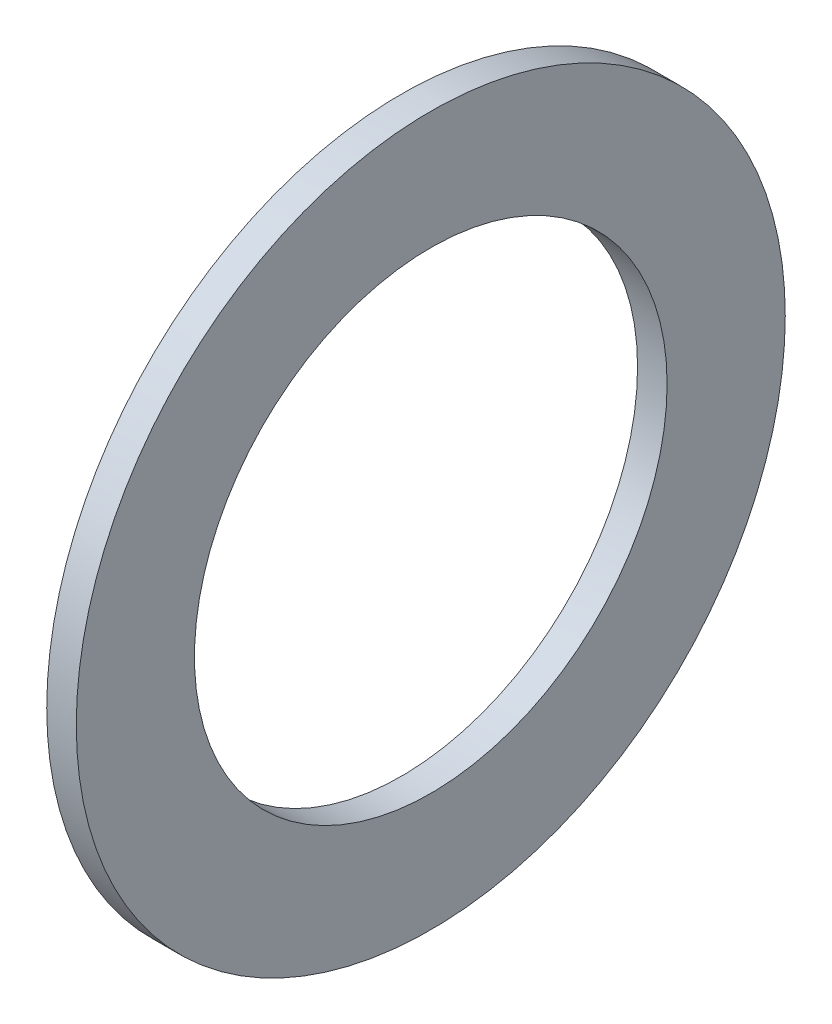
ISO-10303-21;
HEADER;
FILE_DESCRIPTION(('STEP AP214'),'2;1');
FILE_NAME('part.step','',(''),(''),'','','');
FILE_SCHEMA(('AUTOMOTIVE_DESIGN { 1 0 10303 214 1 1 1 1 }'));
ENDSEC;
DATA;
#1=APPLICATION_CONTEXT('core data for automotive mechanical design processes');
#2=APPLICATION_PROTOCOL_DEFINITION('international standard','automotive_design',2000,#1);
#3=PRODUCT_CONTEXT('',#1,'mechanical');
#4=PRODUCT('Part','Part','',(#3));
#5=PRODUCT_RELATED_PRODUCT_CATEGORY('part','',(#4));
#6=PRODUCT_DEFINITION_FORMATION('','',#4);
#7=PRODUCT_DEFINITION_CONTEXT('part definition',#1,'design');
#8=PRODUCT_DEFINITION('design','',#6,#7);
#9=PRODUCT_DEFINITION_SHAPE('','',#8);
#10=(LENGTH_UNIT() NAMED_UNIT(*) SI_UNIT(.MILLI.,.METRE.));
#11=(NAMED_UNIT(*) PLANE_ANGLE_UNIT() SI_UNIT($,.RADIAN.));
#12=(NAMED_UNIT(*) SI_UNIT($,.STERADIAN.) SOLID_ANGLE_UNIT());
#13=UNCERTAINTY_MEASURE_WITH_UNIT(LENGTH_MEASURE(1.E-05),#10,'distance_accuracy_value','');
#14=(GEOMETRIC_REPRESENTATION_CONTEXT(3) GLOBAL_UNCERTAINTY_ASSIGNED_CONTEXT((#13)) GLOBAL_UNIT_ASSIGNED_CONTEXT((#10,
#11,#12)) REPRESENTATION_CONTEXT('',''));
#15=CARTESIAN_POINT('',(0.,0.,0.));
#16=DIRECTION('',(0.,0.,1.));
#17=DIRECTION('',(1.,0.,0.));
#18=AXIS2_PLACEMENT_3D('',#15,#16,#17);
#19=CARTESIAN_POINT('',(6.35,0.,0.));
#20=DIRECTION('',(1.,0.,0.));
#21=DIRECTION('',(0.,0.,-1.));
#22=AXIS2_PLACEMENT_3D('',#19,#20,#21);
#23=PLANE('',#22);
#24=CARTESIAN_POINT('',(6.35,0.,0.));
#25=DIRECTION('',(1.,0.,0.));
#26=DIRECTION('',(0.,0.,-1.));
#27=AXIS2_PLACEMENT_3D('',#24,#25,#26);
#28=CIRCLE('',#27,76.2);
#29=CARTESIAN_POINT('',(6.35,0.,-76.2));
#30=VERTEX_POINT('',#29);
#31=EDGE_CURVE('E10',#30,#30,#28,.T.);
#32=ORIENTED_EDGE('',*,*,#31,.T.);
#33=EDGE_LOOP('',(#32));
#34=FACE_BOUND('',#33,.T.);
#35=CARTESIAN_POINT('',(6.35,0.,0.));
#36=DIRECTION('',(1.,0.,0.));
#37=DIRECTION('',(0.,0.,-1.));
#38=AXIS2_PLACEMENT_3D('',#35,#36,#37);
#39=CIRCLE('',#38,50.8);
#40=CARTESIAN_POINT('',(6.35,0.,-50.8));
#41=VERTEX_POINT('',#40);
#42=EDGE_CURVE('E43',#41,#41,#39,.T.);
#43=ORIENTED_EDGE('',*,*,#42,.F.);
#44=EDGE_LOOP('',(#43));
#45=FACE_BOUND('',#44,.T.);
#46=ADVANCED_FACE('F32',(#34,#45),#23,.T.);
#47=CARTESIAN_POINT('',(0.,0.,0.));
#48=DIRECTION('',(1.,0.,0.));
#49=DIRECTION('',(0.,0.,-1.));
#50=AXIS2_PLACEMENT_3D('',#47,#48,#49);
#51=PLANE('',#50);
#52=CARTESIAN_POINT('',(0.,0.,0.));
#53=DIRECTION('',(1.,0.,0.));
#54=DIRECTION('',(0.,0.,-1.));
#55=AXIS2_PLACEMENT_3D('',#52,#53,#54);
#56=CIRCLE('',#55,76.2);
#57=CARTESIAN_POINT('',(0.,0.,-76.2));
#58=VERTEX_POINT('',#57);
#59=EDGE_CURVE('E36',#58,#58,#56,.T.);
#60=ORIENTED_EDGE('',*,*,#59,.F.);
#61=EDGE_LOOP('',(#60));
#62=FACE_BOUND('',#61,.T.);
#63=CARTESIAN_POINT('',(0.,0.,0.));
#64=DIRECTION('',(1.,0.,0.));
#65=DIRECTION('',(0.,0.,-1.));
#66=AXIS2_PLACEMENT_3D('',#63,#64,#65);
#67=CIRCLE('',#66,50.8);
#68=CARTESIAN_POINT('',(0.,0.,-50.8));
#69=VERTEX_POINT('',#68);
#70=EDGE_CURVE('E45',#69,#69,#67,.T.);
#71=ORIENTED_EDGE('',*,*,#70,.T.);
#72=EDGE_LOOP('',(#71));
#73=FACE_BOUND('',#72,.T.);
#74=ADVANCED_FACE('F55',(#62,#73),#51,.F.);
#75=CARTESIAN_POINT('',(6.35,0.,0.));
#76=DIRECTION('',(-1.,0.,0.));
#77=DIRECTION('',(0.,0.,1.));
#78=AXIS2_PLACEMENT_3D('',#75,#76,#77);
#79=CYLINDRICAL_SURFACE('',#78,76.2);
#80=ORIENTED_EDGE('',*,*,#31,.F.);
#81=EDGE_LOOP('',(#80));
#82=FACE_BOUND('',#81,.T.);
#83=ORIENTED_EDGE('',*,*,#59,.T.);
#84=EDGE_LOOP('',(#83));
#85=FACE_BOUND('',#84,.T.);
#86=ADVANCED_FACE('F34',(#82,#85),#79,.T.);
#87=CARTESIAN_POINT('',(6.35,0.,0.));
#88=DIRECTION('',(-1.,0.,0.));
#89=DIRECTION('',(0.,0.,1.));
#90=AXIS2_PLACEMENT_3D('',#87,#88,#89);
#91=CYLINDRICAL_SURFACE('',#90,50.8);
#92=ORIENTED_EDGE('',*,*,#42,.T.);
#93=EDGE_LOOP('',(#92));
#94=FACE_BOUND('',#93,.T.);
#95=ORIENTED_EDGE('',*,*,#70,.F.);
#96=EDGE_LOOP('',(#95));
#97=FACE_BOUND('',#96,.T.);
#98=ADVANCED_FACE('F51',(#94,#97),#91,.F.);
#99=CLOSED_SHELL('',(#46,#74,#86,#98));
#100=MANIFOLD_SOLID_BREP('B2',#99);
#101=ADVANCED_BREP_SHAPE_REPRESENTATION('',(#18,#100),#14);
#102=SHAPE_DEFINITION_REPRESENTATION(#9,#101);
ENDSEC;
END-ISO-10303-21;
